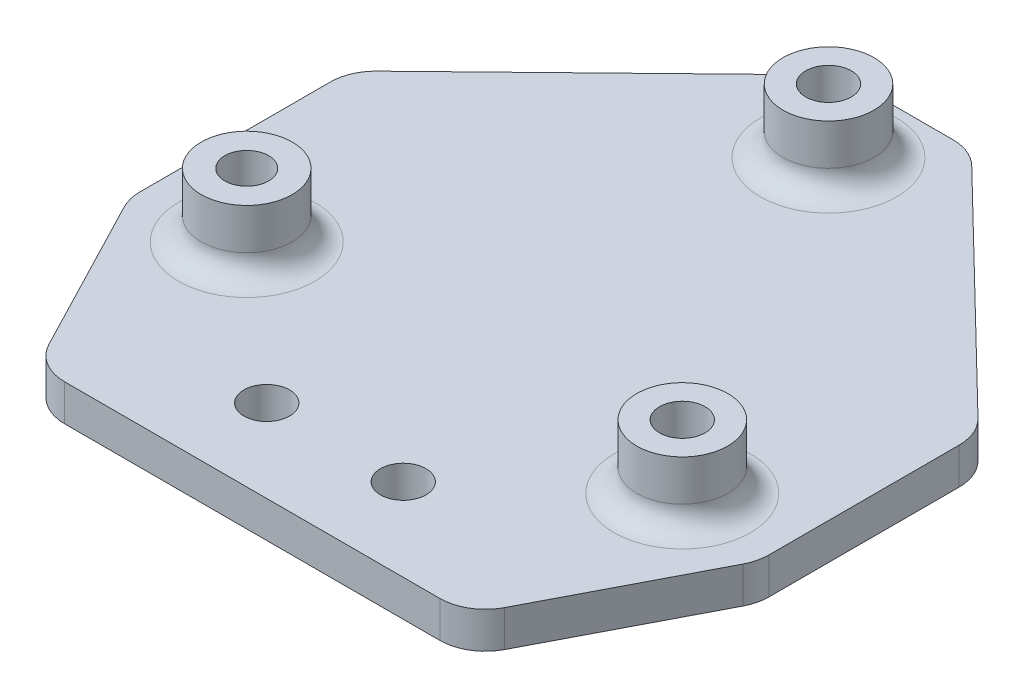
ISO-10303-21;
HEADER;
FILE_DESCRIPTION(('STEP AP214'),'2;1');
FILE_NAME('part.step','',(''),(''),'','','');
FILE_SCHEMA(('AUTOMOTIVE_DESIGN { 1 0 10303 214 1 1 1 1 }'));
ENDSEC;
DATA;
#1=APPLICATION_CONTEXT('core data for automotive mechanical design processes');
#2=APPLICATION_PROTOCOL_DEFINITION('international standard','automotive_design',2000,#1);
#3=PRODUCT_CONTEXT('',#1,'mechanical');
#4=PRODUCT('Part','Part','',(#3));
#5=PRODUCT_RELATED_PRODUCT_CATEGORY('part','',(#4));
#6=PRODUCT_DEFINITION_FORMATION('','',#4);
#7=PRODUCT_DEFINITION_CONTEXT('part definition',#1,'design');
#8=PRODUCT_DEFINITION('design','',#6,#7);
#9=PRODUCT_DEFINITION_SHAPE('','',#8);
#10=(LENGTH_UNIT() NAMED_UNIT(*) SI_UNIT(.MILLI.,.METRE.));
#11=(NAMED_UNIT(*) PLANE_ANGLE_UNIT() SI_UNIT($,.RADIAN.));
#12=(NAMED_UNIT(*) SI_UNIT($,.STERADIAN.) SOLID_ANGLE_UNIT());
#13=UNCERTAINTY_MEASURE_WITH_UNIT(LENGTH_MEASURE(1.E-05),#10,'distance_accuracy_value','');
#14=(GEOMETRIC_REPRESENTATION_CONTEXT(3) GLOBAL_UNCERTAINTY_ASSIGNED_CONTEXT((#13)) GLOBAL_UNIT_ASSIGNED_CONTEXT((#10,
#11,#12)) REPRESENTATION_CONTEXT('',''));
#15=CARTESIAN_POINT('',(0.,0.,0.));
#16=DIRECTION('',(0.,0.,1.));
#17=DIRECTION('',(1.,0.,0.));
#18=AXIS2_PLACEMENT_3D('',#15,#16,#17);
#19=CARTESIAN_POINT('',(0.,4.,0.));
#20=DIRECTION('',(0.,1.,0.));
#21=DIRECTION('',(0.,0.,1.));
#22=AXIS2_PLACEMENT_3D('',#19,#20,#21);
#23=PLANE('',#22);
#24=CARTESIAN_POINT('',(39.0573203615314,4.,34.5219902640101));
#25=DIRECTION('',(0.,1.,0.));
#26=DIRECTION('',(0.,0.,1.));
#27=AXIS2_PLACEMENT_3D('',#24,#25,#26);
#28=CIRCLE('',#27,2.5);
#29=CARTESIAN_POINT('',(39.0573203615314,4.,37.0219902640101));
#30=VERTEX_POINT('',#29);
#31=EDGE_CURVE('E462',#30,#30,#28,.T.);
#32=ORIENTED_EDGE('',*,*,#31,.F.);
#33=EDGE_LOOP('',(#32));
#34=FACE_BOUND('',#33,.T.);
#35=CARTESIAN_POINT('',(24.0573203615314,4.,34.5219902640101));
#36=DIRECTION('',(0.,1.,0.));
#37=DIRECTION('',(0.,0.,1.));
#38=AXIS2_PLACEMENT_3D('',#35,#36,#37);
#39=CIRCLE('',#38,2.5);
#40=CARTESIAN_POINT('',(24.0573203615314,4.,37.0219902640101));
#41=VERTEX_POINT('',#40);
#42=EDGE_CURVE('E459',#41,#41,#39,.T.);
#43=ORIENTED_EDGE('',*,*,#42,.F.);
#44=EDGE_LOOP('',(#43));
#45=FACE_BOUND('',#44,.T.);
#46=CARTESIAN_POINT('',(55.4901242415123,4.,20.2891091035896));
#47=DIRECTION('',(0.,1.,0.));
#48=DIRECTION('',(0.,0.,1.));
#49=AXIS2_PLACEMENT_3D('',#46,#47,#48);
#50=CIRCLE('',#49,7.5);
#51=CARTESIAN_POINT('',(55.4901242415123,4.,27.7891091035896));
#52=VERTEX_POINT('',#51);
#53=EDGE_CURVE('E276',#52,#52,#50,.F.);
#54=ORIENTED_EDGE('',*,*,#53,.T.);
#55=EDGE_LOOP('',(#54));
#56=FACE_BOUND('',#55,.T.);
#57=CARTESIAN_POINT('',(7.62451648155045,4.,20.2891091035896));
#58=DIRECTION('',(0.,1.,0.));
#59=DIRECTION('',(0.,0.,1.));
#60=AXIS2_PLACEMENT_3D('',#57,#58,#59);
#61=CIRCLE('',#60,7.5);
#62=CARTESIAN_POINT('',(7.62451648155045,4.,27.7891091035896));
#63=VERTEX_POINT('',#62);
#64=EDGE_CURVE('E273',#63,#63,#61,.F.);
#65=ORIENTED_EDGE('',*,*,#64,.T.);
#66=EDGE_LOOP('',(#65));
#67=FACE_BOUND('',#66,.T.);
#68=CARTESIAN_POINT('',(31.5573203615314,4.,-19.7108908964104));
#69=DIRECTION('',(0.,1.,0.));
#70=DIRECTION('',(0.,0.,1.));
#71=AXIS2_PLACEMENT_3D('',#68,#69,#70);
#72=CIRCLE('',#71,7.5);
#73=CARTESIAN_POINT('',(31.5573203615314,4.,-12.2108908964104));
#74=VERTEX_POINT('',#73);
#75=EDGE_CURVE('E270',#74,#74,#72,.F.);
#76=ORIENTED_EDGE('',*,*,#75,.T.);
#77=EDGE_LOOP('',(#76));
#78=FACE_BOUND('',#77,.T.);
#79=DIRECTION('',(-1.,0.,0.));
#80=VECTOR('',#79,1.);
#81=CARTESIAN_POINT('',(24.3856415458273,4.,-28.237162663428));
#82=LINE('',#81,#80);
#83=CARTESIAN_POINT('',(36.6997845266153,4.,-28.237162663428));
#84=VERTEX_POINT('',#83);
#85=CARTESIAN_POINT('',(26.4148561964474,4.,-28.237162663428));
#86=VERTEX_POINT('',#85);
#87=EDGE_CURVE('E189',#84,#86,#82,.T.);
#88=ORIENTED_EDGE('',*,*,#87,.T.);
#89=CARTESIAN_POINT('',(26.4148561964474,4.,-23.237162663428));
#90=DIRECTION('',(0.,1.,0.));
#91=DIRECTION('',(0.,0.,1.));
#92=AXIS2_PLACEMENT_3D('',#89,#90,#91);
#93=CIRCLE('',#92,5.);
#94=CARTESIAN_POINT('',(22.9303539735904,4.,-26.82300207128));
#95=VERTEX_POINT('',#94);
#96=EDGE_CURVE('E236',#86,#95,#93,.T.);
#97=ORIENTED_EDGE('',*,*,#96,.T.);
#98=DIRECTION('',(-0.717167881570406,0.,0.696900444571401));
#99=VECTOR('',#98,1.);
#100=CARTESIAN_POINT('',(24.3856415458273,4.,-28.237162663428));
#101=LINE('',#100,#99);
#102=CARTESIAN_POINT('',(-1.48234474784243,4.,-3.10021549737513));
#103=VERTEX_POINT('',#102);
#104=EDGE_CURVE('E172',#95,#103,#101,.T.);
#105=ORIENTED_EDGE('',*,*,#104,.T.);
#106=CARTESIAN_POINT('',(2.00215747501457,4.,0.485623910476907));
#107=DIRECTION('',(0.,1.,0.));
#108=DIRECTION('',(0.,0.,1.));
#109=AXIS2_PLACEMENT_3D('',#106,#107,#108);
#110=CIRCLE('',#109,5.);
#111=CARTESIAN_POINT('',(-2.99784252498543,4.,0.485623910476907));
#112=VERTEX_POINT('',#111);
#113=EDGE_CURVE('E223',#103,#112,#110,.T.);
#114=ORIENTED_EDGE('',*,*,#113,.T.);
#115=DIRECTION('',(0.,0.,1.));
#116=VECTOR('',#115,1.);
#117=CARTESIAN_POINT('',(-2.99784252498543,4.,-1.62754626360348));
#118=LINE('',#117,#116);
#119=CARTESIAN_POINT('',(-2.99784252498543,4.,21.3858892026681));
#120=VERTEX_POINT('',#119);
#121=EDGE_CURVE('E384',#112,#120,#118,.T.);
#122=ORIENTED_EDGE('',*,*,#121,.T.);
#123=CARTESIAN_POINT('',(2.00215747501457,4.,21.3858892026681));
#124=DIRECTION('',(0.,1.,0.));
#125=DIRECTION('',(0.,0.,1.));
#126=AXIS2_PLACEMENT_3D('',#123,#124,#125);
#127=CIRCLE('',#126,5.);
#128=CARTESIAN_POINT('',(-2.4351159796948,4.,23.6903640426548));
#129=VERTEX_POINT('',#128);
#130=EDGE_CURVE('E232',#120,#129,#127,.T.);
#131=ORIENTED_EDGE('',*,*,#130,.T.);
#132=DIRECTION('',(0.460894967997335,0.,0.887454690941873));
#133=VECTOR('',#132,1.);
#134=CARTESIAN_POINT('',(-2.99784252498543,4.,22.6068323336721));
#135=LINE('',#134,#133);
#136=CARTESIAN_POINT('',(6.51166827194202,4.,40.9174248792267));
#137=VERTEX_POINT('',#136);
#138=EDGE_CURVE('E387',#129,#137,#135,.T.);
#139=ORIENTED_EDGE('',*,*,#138,.T.);
#140=CARTESIAN_POINT('',(10.9489417266514,4.,38.6129500392401));
#141=DIRECTION('',(0.,1.,0.));
#142=DIRECTION('',(0.,0.,1.));
#143=AXIS2_PLACEMENT_3D('',#140,#141,#142);
#144=CIRCLE('',#143,5.);
#145=CARTESIAN_POINT('',(10.9489417266514,4.,43.6129500392401));
#146=VERTEX_POINT('',#145);
#147=EDGE_CURVE('E230',#137,#146,#144,.T.);
#148=ORIENTED_EDGE('',*,*,#147,.T.);
#149=DIRECTION('',(1.,0.,0.));
#150=VECTOR('',#149,1.);
#151=CARTESIAN_POINT('',(7.91157521371706,4.,43.6129500392401));
#152=LINE('',#151,#150);
#153=CARTESIAN_POINT('',(52.1656989964113,4.,43.6129500392401));
#154=VERTEX_POINT('',#153);
#155=EDGE_CURVE('E390',#146,#154,#152,.T.);
#156=ORIENTED_EDGE('',*,*,#155,.T.);
#157=CARTESIAN_POINT('',(52.1656989964113,4.,38.6129500392401));
#158=DIRECTION('',(0.,1.,0.));
#159=DIRECTION('',(0.,0.,1.));
#160=AXIS2_PLACEMENT_3D('',#157,#158,#159);
#161=CIRCLE('',#160,5.);
#162=CARTESIAN_POINT('',(56.6029724511207,4.,40.9174248792267));
#163=VERTEX_POINT('',#162);
#164=EDGE_CURVE('E228',#154,#163,#161,.T.);
#165=ORIENTED_EDGE('',*,*,#164,.T.);
#166=DIRECTION('',(0.460894967997335,0.,-0.887454690941873));
#167=VECTOR('',#166,1.);
#168=CARTESIAN_POINT('',(66.1124832480482,4.,22.6068323336721));
#169=LINE('',#168,#167);
#170=CARTESIAN_POINT('',(65.5497567027575,4.,23.6903640426548));
#171=VERTEX_POINT('',#170);
#172=EDGE_CURVE('E396',#163,#171,#169,.T.);
#173=ORIENTED_EDGE('',*,*,#172,.T.);
#174=CARTESIAN_POINT('',(61.1124832480482,4.,21.3858892026681));
#175=DIRECTION('',(0.,1.,0.));
#176=DIRECTION('',(0.,0.,1.));
#177=AXIS2_PLACEMENT_3D('',#174,#175,#176);
#178=CIRCLE('',#177,5.);
#179=CARTESIAN_POINT('',(66.1124832480482,4.,21.3858892026681));
#180=VERTEX_POINT('',#179);
#181=EDGE_CURVE('E226',#171,#180,#178,.T.);
#182=ORIENTED_EDGE('',*,*,#181,.T.);
#183=DIRECTION('',(0.,0.,-1.));
#184=VECTOR('',#183,1.);
#185=CARTESIAN_POINT('',(66.1124832480482,4.,-1.62754626360348));
#186=LINE('',#185,#184);
#187=CARTESIAN_POINT('',(66.1124832480482,4.,0.485623910476903));
#188=VERTEX_POINT('',#187);
#189=EDGE_CURVE('E399',#180,#188,#186,.T.);
#190=ORIENTED_EDGE('',*,*,#189,.T.);
#191=CARTESIAN_POINT('',(61.1124832480482,4.,0.485623910476903));
#192=DIRECTION('',(0.,1.,0.));
#193=DIRECTION('',(0.,0.,1.));
#194=AXIS2_PLACEMENT_3D('',#191,#192,#193);
#195=CIRCLE('',#194,5.);
#196=CARTESIAN_POINT('',(64.5969854709052,4.,-3.10021549737512));
#197=VERTEX_POINT('',#196);
#198=EDGE_CURVE('E59',#188,#197,#195,.T.);
#199=ORIENTED_EDGE('',*,*,#198,.T.);
#200=DIRECTION('',(-0.717167881570406,0.,-0.696900444571401));
#201=VECTOR('',#200,1.);
#202=CARTESIAN_POINT('',(38.7289991772354,4.,-28.237162663428));
#203=LINE('',#202,#201);
#204=CARTESIAN_POINT('',(40.1842867494723,4.,-26.82300207128));
#205=VERTEX_POINT('',#204);
#206=EDGE_CURVE('E400',#197,#205,#203,.T.);
#207=ORIENTED_EDGE('',*,*,#206,.T.);
#208=CARTESIAN_POINT('',(36.6997845266153,4.,-23.237162663428));
#209=DIRECTION('',(0.,1.,0.));
#210=DIRECTION('',(0.,0.,1.));
#211=AXIS2_PLACEMENT_3D('',#208,#209,#210);
#212=CIRCLE('',#211,5.);
#213=EDGE_CURVE('E234',#205,#84,#212,.T.);
#214=ORIENTED_EDGE('',*,*,#213,.T.);
#215=EDGE_LOOP('',(#88,#97,#105,#114,#122,#131,#139,#148,#156,#165,#173,#182,#190,#199,#207,#214));
#216=FACE_BOUND('',#215,.T.);
#217=ADVANCED_FACE('F37',(#34,#45,#56,#67,#78,#216),#23,.T.);
#218=CARTESIAN_POINT('',(0.,0.,0.));
#219=DIRECTION('',(0.,1.,0.));
#220=DIRECTION('',(0.,0.,1.));
#221=AXIS2_PLACEMENT_3D('',#218,#219,#220);
#222=PLANE('',#221);
#223=CARTESIAN_POINT('',(39.0573203615314,0.,34.5219902640101));
#224=DIRECTION('',(0.,1.,0.));
#225=DIRECTION('',(0.,0.,1.));
#226=AXIS2_PLACEMENT_3D('',#223,#224,#225);
#227=CIRCLE('',#226,2.5);
#228=CARTESIAN_POINT('',(39.0573203615314,0.,37.0219902640101));
#229=VERTEX_POINT('',#228);
#230=EDGE_CURVE('E455',#229,#229,#227,.T.);
#231=ORIENTED_EDGE('',*,*,#230,.T.);
#232=EDGE_LOOP('',(#231));
#233=FACE_BOUND('',#232,.T.);
#234=CARTESIAN_POINT('',(24.0573203615314,0.,34.5219902640101));
#235=DIRECTION('',(0.,1.,0.));
#236=DIRECTION('',(0.,0.,1.));
#237=AXIS2_PLACEMENT_3D('',#234,#235,#236);
#238=CIRCLE('',#237,2.5);
#239=CARTESIAN_POINT('',(24.0573203615314,0.,37.0219902640101));
#240=VERTEX_POINT('',#239);
#241=EDGE_CURVE('E456',#240,#240,#238,.T.);
#242=ORIENTED_EDGE('',*,*,#241,.T.);
#243=EDGE_LOOP('',(#242));
#244=FACE_BOUND('',#243,.T.);
#245=DIRECTION('',(-0.717167881570406,0.,0.696900444571401));
#246=VECTOR('',#245,1.);
#247=CARTESIAN_POINT('',(24.3856415458273,0.,-28.237162663428));
#248=LINE('',#247,#246);
#249=CARTESIAN_POINT('',(22.9303539735904,0.,-26.82300207128));
#250=VERTEX_POINT('',#249);
#251=CARTESIAN_POINT('',(-1.48234474784243,0.,-3.10021549737513));
#252=VERTEX_POINT('',#251);
#253=EDGE_CURVE('E169',#250,#252,#248,.T.);
#254=ORIENTED_EDGE('',*,*,#253,.F.);
#255=CARTESIAN_POINT('',(26.4148561964474,0.,-23.237162663428));
#256=DIRECTION('',(0.,1.,0.));
#257=DIRECTION('',(0.,0.,1.));
#258=AXIS2_PLACEMENT_3D('',#255,#256,#257);
#259=CIRCLE('',#258,5.);
#260=CARTESIAN_POINT('',(26.4148561964474,0.,-28.237162663428));
#261=VERTEX_POINT('',#260);
#262=EDGE_CURVE('E152',#250,#261,#259,.F.);
#263=ORIENTED_EDGE('',*,*,#262,.T.);
#264=DIRECTION('',(-1.,0.,0.));
#265=VECTOR('',#264,1.);
#266=CARTESIAN_POINT('',(24.3856415458273,0.,-28.237162663428));
#267=LINE('',#266,#265);
#268=CARTESIAN_POINT('',(36.6997845266153,0.,-28.237162663428));
#269=VERTEX_POINT('',#268);
#270=EDGE_CURVE('E205',#269,#261,#267,.T.);
#271=ORIENTED_EDGE('',*,*,#270,.F.);
#272=CARTESIAN_POINT('',(36.6997845266153,0.,-23.237162663428));
#273=DIRECTION('',(0.,1.,0.));
#274=DIRECTION('',(0.,0.,1.));
#275=AXIS2_PLACEMENT_3D('',#272,#273,#274);
#276=CIRCLE('',#275,5.);
#277=CARTESIAN_POINT('',(40.1842867494723,0.,-26.82300207128));
#278=VERTEX_POINT('',#277);
#279=EDGE_CURVE('E163',#269,#278,#276,.F.);
#280=ORIENTED_EDGE('',*,*,#279,.T.);
#281=DIRECTION('',(-0.717167881570406,0.,-0.696900444571401));
#282=VECTOR('',#281,1.);
#283=CARTESIAN_POINT('',(38.7289991772354,0.,-28.237162663428));
#284=LINE('',#283,#282);
#285=CARTESIAN_POINT('',(64.5969854709052,0.,-3.10021549737512));
#286=VERTEX_POINT('',#285);
#287=EDGE_CURVE('E203',#286,#278,#284,.T.);
#288=ORIENTED_EDGE('',*,*,#287,.F.);
#289=CARTESIAN_POINT('',(61.1124832480482,0.,0.485623910476903));
#290=DIRECTION('',(0.,1.,0.));
#291=DIRECTION('',(0.,0.,1.));
#292=AXIS2_PLACEMENT_3D('',#289,#290,#291);
#293=CIRCLE('',#292,5.);
#294=CARTESIAN_POINT('',(66.1124832480482,0.,0.485623910476903));
#295=VERTEX_POINT('',#294);
#296=EDGE_CURVE('E209',#286,#295,#293,.F.);
#297=ORIENTED_EDGE('',*,*,#296,.T.);
#298=DIRECTION('',(0.,0.,-1.));
#299=VECTOR('',#298,1.);
#300=CARTESIAN_POINT('',(66.1124832480482,0.,-1.62754626360348));
#301=LINE('',#300,#299);
#302=CARTESIAN_POINT('',(66.1124832480482,0.,21.3858892026681));
#303=VERTEX_POINT('',#302);
#304=EDGE_CURVE('E200',#303,#295,#301,.T.);
#305=ORIENTED_EDGE('',*,*,#304,.F.);
#306=CARTESIAN_POINT('',(61.1124832480482,0.,21.3858892026681));
#307=DIRECTION('',(0.,1.,0.));
#308=DIRECTION('',(0.,0.,1.));
#309=AXIS2_PLACEMENT_3D('',#306,#307,#308);
#310=CIRCLE('',#309,5.);
#311=CARTESIAN_POINT('',(65.5497567027575,0.,23.6903640426548));
#312=VERTEX_POINT('',#311);
#313=EDGE_CURVE('E211',#303,#312,#310,.F.);
#314=ORIENTED_EDGE('',*,*,#313,.T.);
#315=DIRECTION('',(0.460894967997335,0.,-0.887454690941873));
#316=VECTOR('',#315,1.);
#317=CARTESIAN_POINT('',(66.1124832480482,0.,22.6068323336721));
#318=LINE('',#317,#316);
#319=CARTESIAN_POINT('',(56.6029724511207,0.,40.9174248792267));
#320=VERTEX_POINT('',#319);
#321=EDGE_CURVE('E197',#320,#312,#318,.T.);
#322=ORIENTED_EDGE('',*,*,#321,.F.);
#323=CARTESIAN_POINT('',(52.1656989964113,0.,38.6129500392401));
#324=DIRECTION('',(0.,1.,0.));
#325=DIRECTION('',(0.,0.,1.));
#326=AXIS2_PLACEMENT_3D('',#323,#324,#325);
#327=CIRCLE('',#326,5.);
#328=CARTESIAN_POINT('',(52.1656989964113,0.,43.6129500392401));
#329=VERTEX_POINT('',#328);
#330=EDGE_CURVE('E213',#320,#329,#327,.F.);
#331=ORIENTED_EDGE('',*,*,#330,.T.);
#332=DIRECTION('',(1.,0.,0.));
#333=VECTOR('',#332,1.);
#334=CARTESIAN_POINT('',(55.2030655093457,0.,43.6129500392401));
#335=LINE('',#334,#333);
#336=CARTESIAN_POINT('',(10.9489417266514,0.,43.6129500392401));
#337=VERTEX_POINT('',#336);
#338=EDGE_CURVE('E194',#337,#329,#335,.T.);
#339=ORIENTED_EDGE('',*,*,#338,.F.);
#340=CARTESIAN_POINT('',(10.9489417266514,0.,38.6129500392401));
#341=DIRECTION('',(0.,1.,0.));
#342=DIRECTION('',(0.,0.,1.));
#343=AXIS2_PLACEMENT_3D('',#340,#341,#342);
#344=CIRCLE('',#343,5.);
#345=CARTESIAN_POINT('',(6.51166827194202,0.,40.9174248792267));
#346=VERTEX_POINT('',#345);
#347=EDGE_CURVE('E215',#337,#346,#344,.F.);
#348=ORIENTED_EDGE('',*,*,#347,.T.);
#349=DIRECTION('',(0.460894967997335,0.,0.887454690941873));
#350=VECTOR('',#349,1.);
#351=CARTESIAN_POINT('',(-2.99784252498543,0.,22.6068323336721));
#352=LINE('',#351,#350);
#353=CARTESIAN_POINT('',(-2.4351159796948,0.,23.6903640426548));
#354=VERTEX_POINT('',#353);
#355=EDGE_CURVE('E183',#354,#346,#352,.T.);
#356=ORIENTED_EDGE('',*,*,#355,.F.);
#357=CARTESIAN_POINT('',(2.00215747501457,0.,21.3858892026681));
#358=DIRECTION('',(0.,1.,0.));
#359=DIRECTION('',(0.,0.,1.));
#360=AXIS2_PLACEMENT_3D('',#357,#358,#359);
#361=CIRCLE('',#360,5.);
#362=CARTESIAN_POINT('',(-2.99784252498543,0.,21.3858892026681));
#363=VERTEX_POINT('',#362);
#364=EDGE_CURVE('E217',#354,#363,#361,.F.);
#365=ORIENTED_EDGE('',*,*,#364,.T.);
#366=DIRECTION('',(0.,0.,1.));
#367=VECTOR('',#366,1.);
#368=CARTESIAN_POINT('',(-2.99784252498543,0.,-1.62754626360348));
#369=LINE('',#368,#367);
#370=CARTESIAN_POINT('',(-2.99784252498543,0.,0.485623910476907));
#371=VERTEX_POINT('',#370);
#372=EDGE_CURVE('E179',#371,#363,#369,.T.);
#373=ORIENTED_EDGE('',*,*,#372,.F.);
#374=CARTESIAN_POINT('',(2.00215747501457,0.,0.485623910476907));
#375=DIRECTION('',(0.,1.,0.));
#376=DIRECTION('',(0.,0.,1.));
#377=AXIS2_PLACEMENT_3D('',#374,#375,#376);
#378=CIRCLE('',#377,5.);
#379=EDGE_CURVE('E173',#371,#252,#378,.F.);
#380=ORIENTED_EDGE('',*,*,#379,.T.);
#381=EDGE_LOOP('',(#254,#263,#271,#280,#288,#297,#305,#314,#322,#331,#339,#348,#356,#365,#373,#380));
#382=FACE_BOUND('',#381,.T.);
#383=CARTESIAN_POINT('',(31.5573203615314,0.,-19.7108908964104));
#384=DIRECTION('',(0.,1.,0.));
#385=DIRECTION('',(0.,0.,1.));
#386=AXIS2_PLACEMENT_3D('',#383,#384,#385);
#387=CIRCLE('',#386,2.5);
#388=CARTESIAN_POINT('',(31.5573203615314,0.,-17.2108908964104));
#389=VERTEX_POINT('',#388);
#390=EDGE_CURVE('E180',#389,#389,#387,.T.);
#391=ORIENTED_EDGE('',*,*,#390,.T.);
#392=EDGE_LOOP('',(#391));
#393=FACE_BOUND('',#392,.T.);
#394=CARTESIAN_POINT('',(55.4901242415123,0.,20.2891091035896));
#395=DIRECTION('',(0.,1.,0.));
#396=DIRECTION('',(0.,0.,1.));
#397=AXIS2_PLACEMENT_3D('',#394,#395,#396);
#398=CIRCLE('',#397,2.5);
#399=CARTESIAN_POINT('',(55.4901242415123,0.,22.7891091035896));
#400=VERTEX_POINT('',#399);
#401=EDGE_CURVE('E186',#400,#400,#398,.T.);
#402=ORIENTED_EDGE('',*,*,#401,.T.);
#403=EDGE_LOOP('',(#402));
#404=FACE_BOUND('',#403,.T.);
#405=CARTESIAN_POINT('',(7.62451648155045,0.,20.2891091035896));
#406=DIRECTION('',(0.,1.,0.));
#407=DIRECTION('',(0.,0.,1.));
#408=AXIS2_PLACEMENT_3D('',#405,#406,#407);
#409=CIRCLE('',#408,2.5);
#410=CARTESIAN_POINT('',(7.62451648155045,0.,22.7891091035896));
#411=VERTEX_POINT('',#410);
#412=EDGE_CURVE('E428',#411,#411,#409,.T.);
#413=ORIENTED_EDGE('',*,*,#412,.T.);
#414=EDGE_LOOP('',(#413));
#415=FACE_BOUND('',#414,.T.);
#416=ADVANCED_FACE('F176',(#233,#244,#382,#393,#404,#415),#222,.F.);
#417=CARTESIAN_POINT('',(24.3856415458273,4.,-28.237162663428));
#418=DIRECTION('',(0.696900444571401,0.,0.717167881570406));
#419=DIRECTION('',(0.717167881570406,0.,-0.696900444571401));
#420=AXIS2_PLACEMENT_3D('',#417,#418,#419);
#421=PLANE('',#420);
#422=ORIENTED_EDGE('',*,*,#104,.F.);
#423=DIRECTION('',(0.,-1.,0.));
#424=VECTOR('',#423,1.);
#425=CARTESIAN_POINT('',(22.9303539735904,4.,-26.82300207128));
#426=LINE('',#425,#424);
#427=EDGE_CURVE('E156',#95,#250,#426,.T.);
#428=ORIENTED_EDGE('',*,*,#427,.T.);
#429=ORIENTED_EDGE('',*,*,#253,.T.);
#430=DIRECTION('',(0.,-1.,0.));
#431=VECTOR('',#430,1.);
#432=CARTESIAN_POINT('',(-1.48234474784243,4.,-3.10021549737512));
#433=LINE('',#432,#431);
#434=EDGE_CURVE('E174',#252,#103,#433,.F.);
#435=ORIENTED_EDGE('',*,*,#434,.T.);
#436=EDGE_LOOP('',(#422,#428,#429,#435));
#437=FACE_BOUND('',#436,.T.);
#438=ADVANCED_FACE('F168',(#437),#421,.F.);
#439=CARTESIAN_POINT('',(-2.99784252498543,4.,-1.62754626360348));
#440=DIRECTION('',(1.,0.,0.));
#441=DIRECTION('',(0.,0.,-1.));
#442=AXIS2_PLACEMENT_3D('',#439,#440,#441);
#443=PLANE('',#442);
#444=ORIENTED_EDGE('',*,*,#372,.T.);
#445=DIRECTION('',(0.,-1.,0.));
#446=VECTOR('',#445,1.);
#447=CARTESIAN_POINT('',(-2.99784252498543,4.,21.3858892026681));
#448=LINE('',#447,#446);
#449=EDGE_CURVE('E250',#363,#120,#448,.F.);
#450=ORIENTED_EDGE('',*,*,#449,.T.);
#451=ORIENTED_EDGE('',*,*,#121,.F.);
#452=DIRECTION('',(0.,-1.,0.));
#453=VECTOR('',#452,1.);
#454=CARTESIAN_POINT('',(-2.99784252498543,4.,0.485623910476907));
#455=LINE('',#454,#453);
#456=EDGE_CURVE('E247',#112,#371,#455,.T.);
#457=ORIENTED_EDGE('',*,*,#456,.T.);
#458=EDGE_LOOP('',(#444,#450,#451,#457));
#459=FACE_BOUND('',#458,.T.);
#460=ADVANCED_FACE('F335',(#459),#443,.F.);
#461=CARTESIAN_POINT('',(-2.99784252498543,4.,22.6068323336721));
#462=DIRECTION('',(0.887454690941873,0.,-0.460894967997335));
#463=DIRECTION('',(-0.460894967997335,0.,-0.887454690941873));
#464=AXIS2_PLACEMENT_3D('',#461,#462,#463);
#465=PLANE('',#464);
#466=ORIENTED_EDGE('',*,*,#138,.F.);
#467=DIRECTION('',(0.,-1.,0.));
#468=VECTOR('',#467,1.);
#469=CARTESIAN_POINT('',(-2.4351159796948,4.,23.6903640426548));
#470=LINE('',#469,#468);
#471=EDGE_CURVE('E244',#129,#354,#470,.T.);
#472=ORIENTED_EDGE('',*,*,#471,.T.);
#473=ORIENTED_EDGE('',*,*,#355,.T.);
#474=DIRECTION('',(0.,-1.,0.));
#475=VECTOR('',#474,1.);
#476=CARTESIAN_POINT('',(6.51166827194202,4.,40.9174248792267));
#477=LINE('',#476,#475);
#478=EDGE_CURVE('E242',#346,#137,#477,.F.);
#479=ORIENTED_EDGE('',*,*,#478,.T.);
#480=EDGE_LOOP('',(#466,#472,#473,#479));
#481=FACE_BOUND('',#480,.T.);
#482=ADVANCED_FACE('F331',(#481),#465,.F.);
#483=CARTESIAN_POINT('',(55.2030655093457,4.,43.6129500392401));
#484=DIRECTION('',(0.,0.,-1.));
#485=DIRECTION('',(-1.,0.,0.));
#486=AXIS2_PLACEMENT_3D('',#483,#484,#485);
#487=PLANE('',#486);
#488=ORIENTED_EDGE('',*,*,#155,.F.);
#489=DIRECTION('',(0.,-1.,0.));
#490=VECTOR('',#489,1.);
#491=CARTESIAN_POINT('',(10.9489417266514,4.,43.6129500392401));
#492=LINE('',#491,#490);
#493=EDGE_CURVE('E254',#146,#337,#492,.T.);
#494=ORIENTED_EDGE('',*,*,#493,.T.);
#495=ORIENTED_EDGE('',*,*,#338,.T.);
#496=DIRECTION('',(0.,-1.,0.));
#497=VECTOR('',#496,1.);
#498=CARTESIAN_POINT('',(52.1656989964113,4.,43.6129500392401));
#499=LINE('',#498,#497);
#500=EDGE_CURVE('E252',#329,#154,#499,.F.);
#501=ORIENTED_EDGE('',*,*,#500,.T.);
#502=EDGE_LOOP('',(#488,#494,#495,#501));
#503=FACE_BOUND('',#502,.T.);
#504=ADVANCED_FACE('F327',(#503),#487,.F.);
#505=CARTESIAN_POINT('',(66.1124832480482,4.,22.6068323336721));
#506=DIRECTION('',(-0.887454690941873,0.,-0.460894967997335));
#507=DIRECTION('',(-0.460894967997335,0.,0.887454690941873));
#508=AXIS2_PLACEMENT_3D('',#505,#506,#507);
#509=PLANE('',#508);
#510=ORIENTED_EDGE('',*,*,#172,.F.);
#511=DIRECTION('',(0.,-1.,0.));
#512=VECTOR('',#511,1.);
#513=CARTESIAN_POINT('',(56.6029724511207,4.,40.9174248792267));
#514=LINE('',#513,#512);
#515=EDGE_CURVE('E259',#163,#320,#514,.T.);
#516=ORIENTED_EDGE('',*,*,#515,.T.);
#517=ORIENTED_EDGE('',*,*,#321,.T.);
#518=DIRECTION('',(0.,-1.,0.));
#519=VECTOR('',#518,1.);
#520=CARTESIAN_POINT('',(65.5497567027575,4.,23.6903640426548));
#521=LINE('',#520,#519);
#522=EDGE_CURVE('E257',#312,#171,#521,.F.);
#523=ORIENTED_EDGE('',*,*,#522,.T.);
#524=EDGE_LOOP('',(#510,#516,#517,#523));
#525=FACE_BOUND('',#524,.T.);
#526=ADVANCED_FACE('F323',(#525),#509,.F.);
#527=CARTESIAN_POINT('',(66.1124832480482,4.,-1.62754626360348));
#528=DIRECTION('',(-1.,0.,0.));
#529=DIRECTION('',(0.,0.,1.));
#530=AXIS2_PLACEMENT_3D('',#527,#528,#529);
#531=PLANE('',#530);
#532=ORIENTED_EDGE('',*,*,#189,.F.);
#533=DIRECTION('',(0.,-1.,0.));
#534=VECTOR('',#533,1.);
#535=CARTESIAN_POINT('',(66.1124832480482,4.,21.3858892026681));
#536=LINE('',#535,#534);
#537=EDGE_CURVE('E264',#180,#303,#536,.T.);
#538=ORIENTED_EDGE('',*,*,#537,.T.);
#539=ORIENTED_EDGE('',*,*,#304,.T.);
#540=DIRECTION('',(0.,-1.,0.));
#541=VECTOR('',#540,1.);
#542=CARTESIAN_POINT('',(66.1124832480482,4.,0.485623910476903));
#543=LINE('',#542,#541);
#544=EDGE_CURVE('E262',#295,#188,#543,.F.);
#545=ORIENTED_EDGE('',*,*,#544,.T.);
#546=EDGE_LOOP('',(#532,#538,#539,#545));
#547=FACE_BOUND('',#546,.T.);
#548=ADVANCED_FACE('F320',(#547),#531,.F.);
#549=CARTESIAN_POINT('',(38.7289991772354,4.,-28.237162663428));
#550=DIRECTION('',(-0.696900444571401,0.,0.717167881570406));
#551=DIRECTION('',(0.717167881570406,0.,0.696900444571401));
#552=AXIS2_PLACEMENT_3D('',#549,#550,#551);
#553=PLANE('',#552);
#554=ORIENTED_EDGE('',*,*,#287,.T.);
#555=DIRECTION('',(0.,-1.,0.));
#556=VECTOR('',#555,1.);
#557=CARTESIAN_POINT('',(40.1842867494723,4.,-26.82300207128));
#558=LINE('',#557,#556);
#559=EDGE_CURVE('E52',#278,#205,#558,.F.);
#560=ORIENTED_EDGE('',*,*,#559,.T.);
#561=ORIENTED_EDGE('',*,*,#206,.F.);
#562=DIRECTION('',(0.,-1.,0.));
#563=VECTOR('',#562,1.);
#564=CARTESIAN_POINT('',(64.5969854709052,4.,-3.10021549737513));
#565=LINE('',#564,#563);
#566=EDGE_CURVE('E238',#197,#286,#565,.T.);
#567=ORIENTED_EDGE('',*,*,#566,.T.);
#568=EDGE_LOOP('',(#554,#560,#561,#567));
#569=FACE_BOUND('',#568,.T.);
#570=ADVANCED_FACE('F316',(#569),#553,.F.);
#571=CARTESIAN_POINT('',(24.3856415458273,4.,-28.237162663428));
#572=DIRECTION('',(0.,0.,1.));
#573=DIRECTION('',(1.,0.,0.));
#574=AXIS2_PLACEMENT_3D('',#571,#572,#573);
#575=PLANE('',#574);
#576=ORIENTED_EDGE('',*,*,#270,.T.);
#577=DIRECTION('',(0.,-1.,0.));
#578=VECTOR('',#577,1.);
#579=CARTESIAN_POINT('',(26.4148561964474,4.,-28.237162663428));
#580=LINE('',#579,#578);
#581=EDGE_CURVE('E157',#261,#86,#580,.F.);
#582=ORIENTED_EDGE('',*,*,#581,.T.);
#583=ORIENTED_EDGE('',*,*,#87,.F.);
#584=DIRECTION('',(0.,-1.,0.));
#585=VECTOR('',#584,1.);
#586=CARTESIAN_POINT('',(36.6997845266153,4.,-28.237162663428));
#587=LINE('',#586,#585);
#588=EDGE_CURVE('E162',#84,#269,#587,.T.);
#589=ORIENTED_EDGE('',*,*,#588,.T.);
#590=EDGE_LOOP('',(#576,#582,#583,#589));
#591=FACE_BOUND('',#590,.T.);
#592=ADVANCED_FACE('F313',(#591),#575,.F.);
#593=CARTESIAN_POINT('',(31.5573203615314,4.,-19.7108908964104));
#594=DIRECTION('',(0.,-1.,0.));
#595=DIRECTION('',(0.,0.,-1.));
#596=AXIS2_PLACEMENT_3D('',#593,#594,#595);
#597=CYLINDRICAL_SURFACE('',#596,2.5);
#598=ORIENTED_EDGE('',*,*,#390,.F.);
#599=EDGE_LOOP('',(#598));
#600=FACE_BOUND('',#599,.T.);
#601=CARTESIAN_POINT('',(31.5573203615314,11.,-19.7108908964104));
#602=DIRECTION('',(0.,1.,0.));
#603=DIRECTION('',(0.,0.,1.));
#604=AXIS2_PLACEMENT_3D('',#601,#602,#603);
#605=CIRCLE('',#604,2.5);
#606=CARTESIAN_POINT('',(31.5573203615314,11.,-17.2108908964104));
#607=VERTEX_POINT('',#606);
#608=EDGE_CURVE('E434',#607,#607,#605,.T.);
#609=ORIENTED_EDGE('',*,*,#608,.T.);
#610=EDGE_LOOP('',(#609));
#611=FACE_BOUND('',#610,.T.);
#612=ADVANCED_FACE('F310',(#600,#611),#597,.F.);
#613=CARTESIAN_POINT('',(55.4901242415123,4.,20.2891091035896));
#614=DIRECTION('',(0.,-1.,0.));
#615=DIRECTION('',(0.,0.,-1.));
#616=AXIS2_PLACEMENT_3D('',#613,#614,#615);
#617=CYLINDRICAL_SURFACE('',#616,2.5);
#618=ORIENTED_EDGE('',*,*,#401,.F.);
#619=EDGE_LOOP('',(#618));
#620=FACE_BOUND('',#619,.T.);
#621=CARTESIAN_POINT('',(55.4901242415123,11.,20.2891091035896));
#622=DIRECTION('',(0.,1.,0.));
#623=DIRECTION('',(0.,0.,1.));
#624=AXIS2_PLACEMENT_3D('',#621,#622,#623);
#625=CIRCLE('',#624,2.5);
#626=CARTESIAN_POINT('',(55.4901242415123,11.,22.7891091035896));
#627=VERTEX_POINT('',#626);
#628=EDGE_CURVE('E437',#627,#627,#625,.T.);
#629=ORIENTED_EDGE('',*,*,#628,.T.);
#630=EDGE_LOOP('',(#629));
#631=FACE_BOUND('',#630,.T.);
#632=ADVANCED_FACE('F504',(#620,#631),#617,.F.);
#633=CARTESIAN_POINT('',(7.62451648155045,4.,20.2891091035896));
#634=DIRECTION('',(0.,-1.,0.));
#635=DIRECTION('',(0.,0.,-1.));
#636=AXIS2_PLACEMENT_3D('',#633,#634,#635);
#637=CYLINDRICAL_SURFACE('',#636,2.5);
#638=CARTESIAN_POINT('',(7.62451648155045,4.,20.2891091035896));
#639=DIRECTION('',(0.,1.,0.));
#640=DIRECTION('',(0.,0.,1.));
#641=AXIS2_PLACEMENT_3D('',#638,#639,#640);
#642=CIRCLE('',#641,2.5);
#643=CARTESIAN_POINT('',(7.62451648155045,4.,22.7891091035896));
#644=VERTEX_POINT('',#643);
#645=EDGE_CURVE('E443',#644,#644,#642,.T.);
#646=ORIENTED_EDGE('',*,*,#645,.T.);
#647=EDGE_LOOP('',(#646));
#648=FACE_BOUND('',#647,.T.);
#649=ORIENTED_EDGE('',*,*,#412,.F.);
#650=EDGE_LOOP('',(#649));
#651=FACE_BOUND('',#650,.T.);
#652=ADVANCED_FACE('F345',(#648,#651),#637,.F.);
#653=CARTESIAN_POINT('',(26.4148561964474,4.,-23.237162663428));
#654=DIRECTION('',(0.,-1.,0.));
#655=DIRECTION('',(0.,0.,-1.));
#656=AXIS2_PLACEMENT_3D('',#653,#654,#655);
#657=CYLINDRICAL_SURFACE('',#656,5.);
#658=ORIENTED_EDGE('',*,*,#96,.F.);
#659=ORIENTED_EDGE('',*,*,#581,.F.);
#660=ORIENTED_EDGE('',*,*,#262,.F.);
#661=ORIENTED_EDGE('',*,*,#427,.F.);
#662=EDGE_LOOP('',(#658,#659,#660,#661));
#663=FACE_BOUND('',#662,.T.);
#664=ADVANCED_FACE('F155',(#663),#657,.T.);
#665=CARTESIAN_POINT('',(36.6997845266153,4.,-23.237162663428));
#666=DIRECTION('',(0.,-1.,0.));
#667=DIRECTION('',(0.,0.,-1.));
#668=AXIS2_PLACEMENT_3D('',#665,#666,#667);
#669=CYLINDRICAL_SURFACE('',#668,5.);
#670=ORIENTED_EDGE('',*,*,#213,.F.);
#671=ORIENTED_EDGE('',*,*,#559,.F.);
#672=ORIENTED_EDGE('',*,*,#279,.F.);
#673=ORIENTED_EDGE('',*,*,#588,.F.);
#674=EDGE_LOOP('',(#670,#671,#672,#673));
#675=FACE_BOUND('',#674,.T.);
#676=ADVANCED_FACE('F344',(#675),#669,.T.);
#677=CARTESIAN_POINT('',(2.00215747501457,4.,21.3858892026681));
#678=DIRECTION('',(0.,-1.,0.));
#679=DIRECTION('',(0.,0.,-1.));
#680=AXIS2_PLACEMENT_3D('',#677,#678,#679);
#681=CYLINDRICAL_SURFACE('',#680,5.);
#682=ORIENTED_EDGE('',*,*,#130,.F.);
#683=ORIENTED_EDGE('',*,*,#449,.F.);
#684=ORIENTED_EDGE('',*,*,#364,.F.);
#685=ORIENTED_EDGE('',*,*,#471,.F.);
#686=EDGE_LOOP('',(#682,#683,#684,#685));
#687=FACE_BOUND('',#686,.T.);
#688=ADVANCED_FACE('F348',(#687),#681,.T.);
#689=CARTESIAN_POINT('',(10.9489417266514,4.,38.6129500392401));
#690=DIRECTION('',(0.,-1.,0.));
#691=DIRECTION('',(0.,0.,-1.));
#692=AXIS2_PLACEMENT_3D('',#689,#690,#691);
#693=CYLINDRICAL_SURFACE('',#692,5.);
#694=ORIENTED_EDGE('',*,*,#147,.F.);
#695=ORIENTED_EDGE('',*,*,#478,.F.);
#696=ORIENTED_EDGE('',*,*,#347,.F.);
#697=ORIENTED_EDGE('',*,*,#493,.F.);
#698=EDGE_LOOP('',(#694,#695,#696,#697));
#699=FACE_BOUND('',#698,.T.);
#700=ADVANCED_FACE('F352',(#699),#693,.T.);
#701=CARTESIAN_POINT('',(52.1656989964113,4.,38.6129500392401));
#702=DIRECTION('',(0.,-1.,0.));
#703=DIRECTION('',(0.,0.,-1.));
#704=AXIS2_PLACEMENT_3D('',#701,#702,#703);
#705=CYLINDRICAL_SURFACE('',#704,5.);
#706=ORIENTED_EDGE('',*,*,#164,.F.);
#707=ORIENTED_EDGE('',*,*,#500,.F.);
#708=ORIENTED_EDGE('',*,*,#330,.F.);
#709=ORIENTED_EDGE('',*,*,#515,.F.);
#710=EDGE_LOOP('',(#706,#707,#708,#709));
#711=FACE_BOUND('',#710,.T.);
#712=ADVANCED_FACE('F356',(#711),#705,.T.);
#713=CARTESIAN_POINT('',(61.1124832480482,4.,21.3858892026681));
#714=DIRECTION('',(0.,-1.,0.));
#715=DIRECTION('',(0.,0.,-1.));
#716=AXIS2_PLACEMENT_3D('',#713,#714,#715);
#717=CYLINDRICAL_SURFACE('',#716,5.);
#718=ORIENTED_EDGE('',*,*,#181,.F.);
#719=ORIENTED_EDGE('',*,*,#522,.F.);
#720=ORIENTED_EDGE('',*,*,#313,.F.);
#721=ORIENTED_EDGE('',*,*,#537,.F.);
#722=EDGE_LOOP('',(#718,#719,#720,#721));
#723=FACE_BOUND('',#722,.T.);
#724=ADVANCED_FACE('F360',(#723),#717,.T.);
#725=CARTESIAN_POINT('',(61.1124832480482,4.,0.485623910476903));
#726=DIRECTION('',(0.,-1.,0.));
#727=DIRECTION('',(0.,0.,-1.));
#728=AXIS2_PLACEMENT_3D('',#725,#726,#727);
#729=CYLINDRICAL_SURFACE('',#728,5.);
#730=ORIENTED_EDGE('',*,*,#198,.F.);
#731=ORIENTED_EDGE('',*,*,#544,.F.);
#732=ORIENTED_EDGE('',*,*,#296,.F.);
#733=ORIENTED_EDGE('',*,*,#566,.F.);
#734=EDGE_LOOP('',(#730,#731,#732,#733));
#735=FACE_BOUND('',#734,.T.);
#736=ADVANCED_FACE('F364',(#735),#729,.T.);
#737=CARTESIAN_POINT('',(2.00215747501457,4.,0.485623910476907));
#738=DIRECTION('',(0.,-1.,0.));
#739=DIRECTION('',(0.,0.,-1.));
#740=AXIS2_PLACEMENT_3D('',#737,#738,#739);
#741=CYLINDRICAL_SURFACE('',#740,5.);
#742=ORIENTED_EDGE('',*,*,#113,.F.);
#743=ORIENTED_EDGE('',*,*,#434,.F.);
#744=ORIENTED_EDGE('',*,*,#379,.F.);
#745=ORIENTED_EDGE('',*,*,#456,.F.);
#746=EDGE_LOOP('',(#742,#743,#744,#745));
#747=FACE_BOUND('',#746,.T.);
#748=ADVANCED_FACE('F368',(#747),#741,.T.);
#749=CARTESIAN_POINT('',(31.5573203615314,11.,-19.7108908964104));
#750=DIRECTION('',(0.,1.,0.));
#751=DIRECTION('',(0.,0.,1.));
#752=AXIS2_PLACEMENT_3D('',#749,#750,#751);
#753=PLANE('',#752);
#754=CARTESIAN_POINT('',(31.5573203615314,11.,-19.7108908964104));
#755=DIRECTION('',(0.,1.,0.));
#756=DIRECTION('',(0.,0.,1.));
#757=AXIS2_PLACEMENT_3D('',#754,#755,#756);
#758=CIRCLE('',#757,5.);
#759=CARTESIAN_POINT('',(31.5573203615314,11.,-14.7108908964104));
#760=VERTEX_POINT('',#759);
#761=EDGE_CURVE('E431',#760,#760,#758,.T.);
#762=ORIENTED_EDGE('',*,*,#761,.T.);
#763=EDGE_LOOP('',(#762));
#764=FACE_BOUND('',#763,.T.);
#765=ORIENTED_EDGE('',*,*,#608,.F.);
#766=EDGE_LOOP('',(#765));
#767=FACE_BOUND('',#766,.T.);
#768=ADVANCED_FACE('F371',(#764,#767),#753,.T.);
#769=CARTESIAN_POINT('',(31.5573203615314,11.,-19.7108908964104));
#770=DIRECTION('',(0.,-1.,0.));
#771=DIRECTION('',(0.,0.,-1.));
#772=AXIS2_PLACEMENT_3D('',#769,#770,#771);
#773=CYLINDRICAL_SURFACE('',#772,5.);
#774=CARTESIAN_POINT('',(31.5573203615314,6.5,-19.7108908964104));
#775=DIRECTION('',(0.,1.,0.));
#776=DIRECTION('',(0.,0.,1.));
#777=AXIS2_PLACEMENT_3D('',#774,#775,#776);
#778=CIRCLE('',#777,5.);
#779=CARTESIAN_POINT('',(31.5573203615314,6.5,-14.7108908964104));
#780=VERTEX_POINT('',#779);
#781=EDGE_CURVE('E11',#780,#780,#778,.T.);
#782=ORIENTED_EDGE('',*,*,#781,.T.);
#783=EDGE_LOOP('',(#782));
#784=FACE_BOUND('',#783,.T.);
#785=ORIENTED_EDGE('',*,*,#761,.F.);
#786=EDGE_LOOP('',(#785));
#787=FACE_BOUND('',#786,.T.);
#788=ADVANCED_FACE('F376',(#784,#787),#773,.T.);
#789=CARTESIAN_POINT('',(55.4901242415123,11.,20.2891091035896));
#790=DIRECTION('',(0.,1.,0.));
#791=DIRECTION('',(0.,0.,1.));
#792=AXIS2_PLACEMENT_3D('',#789,#790,#791);
#793=PLANE('',#792);
#794=CARTESIAN_POINT('',(55.4901242415123,11.,20.2891091035896));
#795=DIRECTION('',(0.,1.,0.));
#796=DIRECTION('',(0.,0.,1.));
#797=AXIS2_PLACEMENT_3D('',#794,#795,#796);
#798=CIRCLE('',#797,5.);
#799=CARTESIAN_POINT('',(55.4901242415123,11.,25.2891091035896));
#800=VERTEX_POINT('',#799);
#801=EDGE_CURVE('E440',#800,#800,#798,.T.);
#802=ORIENTED_EDGE('',*,*,#801,.T.);
#803=EDGE_LOOP('',(#802));
#804=FACE_BOUND('',#803,.T.);
#805=ORIENTED_EDGE('',*,*,#628,.F.);
#806=EDGE_LOOP('',(#805));
#807=FACE_BOUND('',#806,.T.);
#808=ADVANCED_FACE('F495',(#804,#807),#793,.T.);
#809=CARTESIAN_POINT('',(55.4901242415123,11.,20.2891091035896));
#810=DIRECTION('',(0.,-1.,0.));
#811=DIRECTION('',(0.,0.,-1.));
#812=AXIS2_PLACEMENT_3D('',#809,#810,#811);
#813=CYLINDRICAL_SURFACE('',#812,5.);
#814=CARTESIAN_POINT('',(55.4901242415123,6.5,20.2891091035896));
#815=DIRECTION('',(0.,1.,0.));
#816=DIRECTION('',(0.,0.,1.));
#817=AXIS2_PLACEMENT_3D('',#814,#815,#816);
#818=CIRCLE('',#817,5.);
#819=CARTESIAN_POINT('',(55.4901242415123,6.5,25.2891091035896));
#820=VERTEX_POINT('',#819);
#821=EDGE_CURVE('E267',#820,#820,#818,.T.);
#822=ORIENTED_EDGE('',*,*,#821,.T.);
#823=EDGE_LOOP('',(#822));
#824=FACE_BOUND('',#823,.T.);
#825=ORIENTED_EDGE('',*,*,#801,.F.);
#826=EDGE_LOOP('',(#825));
#827=FACE_BOUND('',#826,.T.);
#828=ADVANCED_FACE('F485',(#824,#827),#813,.T.);
#829=CARTESIAN_POINT('',(7.62451648155045,4.,20.2891091035896));
#830=DIRECTION('',(0.,1.,0.));
#831=DIRECTION('',(0.,0.,1.));
#832=AXIS2_PLACEMENT_3D('',#829,#830,#831);
#833=PLANE('',#832);
#834=CARTESIAN_POINT('',(7.62451648155045,4.,20.2891091035896));
#835=DIRECTION('',(0.,1.,0.));
#836=DIRECTION('',(0.,0.,1.));
#837=AXIS2_PLACEMENT_3D('',#834,#835,#836);
#838=CIRCLE('',#837,2.41062289431194);
#839=CARTESIAN_POINT('',(7.62451648155045,4.,22.6997319979015));
#840=VERTEX_POINT('',#839);
#841=EDGE_CURVE('E446',#840,#840,#838,.T.);
#842=ORIENTED_EDGE('',*,*,#841,.T.);
#843=EDGE_LOOP('',(#842));
#844=FACE_BOUND('',#843,.T.);
#845=ORIENTED_EDGE('',*,*,#645,.F.);
#846=EDGE_LOOP('',(#845));
#847=FACE_BOUND('',#846,.T.);
#848=ADVANCED_FACE('F482',(#844,#847),#833,.F.);
#849=CARTESIAN_POINT('',(7.62451648155045,11.,20.2891091035896));
#850=DIRECTION('',(0.,1.,0.));
#851=DIRECTION('',(0.,0.,1.));
#852=AXIS2_PLACEMENT_3D('',#849,#850,#851);
#853=PLANE('',#852);
#854=CARTESIAN_POINT('',(7.62451648155045,11.,20.2891091035896));
#855=DIRECTION('',(0.,1.,0.));
#856=DIRECTION('',(0.,0.,1.));
#857=AXIS2_PLACEMENT_3D('',#854,#855,#856);
#858=CIRCLE('',#857,5.);
#859=CARTESIAN_POINT('',(7.62451648155045,11.,25.2891091035896));
#860=VERTEX_POINT('',#859);
#861=EDGE_CURVE('E450',#860,#860,#858,.T.);
#862=ORIENTED_EDGE('',*,*,#861,.T.);
#863=EDGE_LOOP('',(#862));
#864=FACE_BOUND('',#863,.T.);
#865=CARTESIAN_POINT('',(7.62451648155045,11.,20.2891091035896));
#866=DIRECTION('',(0.,1.,0.));
#867=DIRECTION('',(0.,0.,1.));
#868=AXIS2_PLACEMENT_3D('',#865,#866,#867);
#869=CIRCLE('',#868,2.41062289431194);
#870=CARTESIAN_POINT('',(7.62451648155045,11.,22.6997319979015));
#871=VERTEX_POINT('',#870);
#872=EDGE_CURVE('E447',#871,#871,#869,.T.);
#873=ORIENTED_EDGE('',*,*,#872,.F.);
#874=EDGE_LOOP('',(#873));
#875=FACE_BOUND('',#874,.T.);
#876=ADVANCED_FACE('F481',(#864,#875),#853,.T.);
#877=CARTESIAN_POINT('',(7.62451648155045,11.,20.2891091035896));
#878=DIRECTION('',(0.,-1.,0.));
#879=DIRECTION('',(0.,0.,-1.));
#880=AXIS2_PLACEMENT_3D('',#877,#878,#879);
#881=CYLINDRICAL_SURFACE('',#880,5.);
#882=CARTESIAN_POINT('',(7.62451648155045,6.5,20.2891091035896));
#883=DIRECTION('',(0.,1.,0.));
#884=DIRECTION('',(0.,0.,1.));
#885=AXIS2_PLACEMENT_3D('',#882,#883,#884);
#886=CIRCLE('',#885,5.);
#887=CARTESIAN_POINT('',(7.62451648155045,6.5,25.2891091035896));
#888=VERTEX_POINT('',#887);
#889=EDGE_CURVE('E45',#888,#888,#886,.T.);
#890=ORIENTED_EDGE('',*,*,#889,.T.);
#891=EDGE_LOOP('',(#890));
#892=FACE_BOUND('',#891,.T.);
#893=ORIENTED_EDGE('',*,*,#861,.F.);
#894=EDGE_LOOP('',(#893));
#895=FACE_BOUND('',#894,.T.);
#896=ADVANCED_FACE('F281',(#892,#895),#881,.T.);
#897=CARTESIAN_POINT('',(7.62451648155045,11.,20.2891091035896));
#898=DIRECTION('',(0.,-1.,0.));
#899=DIRECTION('',(0.,0.,-1.));
#900=AXIS2_PLACEMENT_3D('',#897,#898,#899);
#901=CYLINDRICAL_SURFACE('',#900,2.41062289431194);
#902=ORIENTED_EDGE('',*,*,#872,.T.);
#903=EDGE_LOOP('',(#902));
#904=FACE_BOUND('',#903,.T.);
#905=ORIENTED_EDGE('',*,*,#841,.F.);
#906=EDGE_LOOP('',(#905));
#907=FACE_BOUND('',#906,.T.);
#908=ADVANCED_FACE('F294',(#904,#907),#901,.F.);
#909=CARTESIAN_POINT('',(55.4901242415123,6.5,20.2891091035896));
#910=DIRECTION('',(0.,1.,0.));
#911=DIRECTION('',(0.,0.,1.));
#912=AXIS2_PLACEMENT_3D('',#909,#910,#911);
#913=TOROIDAL_SURFACE('',#912,7.5,2.5);
#914=ORIENTED_EDGE('',*,*,#53,.F.);
#915=EDGE_LOOP('',(#914));
#916=FACE_BOUND('',#915,.T.);
#917=ORIENTED_EDGE('',*,*,#821,.F.);
#918=EDGE_LOOP('',(#917));
#919=FACE_BOUND('',#918,.T.);
#920=ADVANCED_FACE('F286',(#916,#919),#913,.F.);
#921=CARTESIAN_POINT('',(7.62451648155045,6.5,20.2891091035896));
#922=DIRECTION('',(0.,1.,0.));
#923=DIRECTION('',(0.,0.,1.));
#924=AXIS2_PLACEMENT_3D('',#921,#922,#923);
#925=TOROIDAL_SURFACE('',#924,7.5,2.5);
#926=ORIENTED_EDGE('',*,*,#64,.F.);
#927=EDGE_LOOP('',(#926));
#928=FACE_BOUND('',#927,.T.);
#929=ORIENTED_EDGE('',*,*,#889,.F.);
#930=EDGE_LOOP('',(#929));
#931=FACE_BOUND('',#930,.T.);
#932=ADVANCED_FACE('F284',(#928,#931),#925,.F.);
#933=CARTESIAN_POINT('',(31.5573203615314,6.5,-19.7108908964104));
#934=DIRECTION('',(0.,1.,0.));
#935=DIRECTION('',(0.,0.,1.));
#936=AXIS2_PLACEMENT_3D('',#933,#934,#935);
#937=TOROIDAL_SURFACE('',#936,7.5,2.5);
#938=ORIENTED_EDGE('',*,*,#75,.F.);
#939=EDGE_LOOP('',(#938));
#940=FACE_BOUND('',#939,.T.);
#941=ORIENTED_EDGE('',*,*,#781,.F.);
#942=EDGE_LOOP('',(#941));
#943=FACE_BOUND('',#942,.T.);
#944=ADVANCED_FACE('F39',(#940,#943),#937,.F.);
#945=CARTESIAN_POINT('',(24.0573203615314,0.,34.5219902640101));
#946=DIRECTION('',(0.,1.,0.));
#947=DIRECTION('',(0.,0.,1.));
#948=AXIS2_PLACEMENT_3D('',#945,#946,#947);
#949=CYLINDRICAL_SURFACE('',#948,2.5);
#950=ORIENTED_EDGE('',*,*,#241,.F.);
#951=EDGE_LOOP('',(#950));
#952=FACE_BOUND('',#951,.T.);
#953=ORIENTED_EDGE('',*,*,#42,.T.);
#954=EDGE_LOOP('',(#953));
#955=FACE_BOUND('',#954,.T.);
#956=ADVANCED_FACE('F292',(#952,#955),#949,.F.);
#957=CARTESIAN_POINT('',(39.0573203615314,0.,34.5219902640101));
#958=DIRECTION('',(0.,1.,0.));
#959=DIRECTION('',(0.,0.,1.));
#960=AXIS2_PLACEMENT_3D('',#957,#958,#959);
#961=CYLINDRICAL_SURFACE('',#960,2.5);
#962=ORIENTED_EDGE('',*,*,#230,.F.);
#963=EDGE_LOOP('',(#962));
#964=FACE_BOUND('',#963,.T.);
#965=ORIENTED_EDGE('',*,*,#31,.T.);
#966=EDGE_LOOP('',(#965));
#967=FACE_BOUND('',#966,.T.);
#968=ADVANCED_FACE('F469',(#964,#967),#961,.F.);
#969=CLOSED_SHELL('',(#217,#416,#438,#460,#482,#504,#526,#548,#570,#592,#612,#632,#652,#664,
#676,#688,#700,#712,#724,#736,#748,#768,#788,#808,#828,#848,#876,#896,#908,#920,#932,#944,#956,#968));
#970=MANIFOLD_SOLID_BREP('B2',#969);
#971=ADVANCED_BREP_SHAPE_REPRESENTATION('',(#18,#970),#14);
#972=SHAPE_DEFINITION_REPRESENTATION(#9,#971);
ENDSEC;
END-ISO-10303-21;
